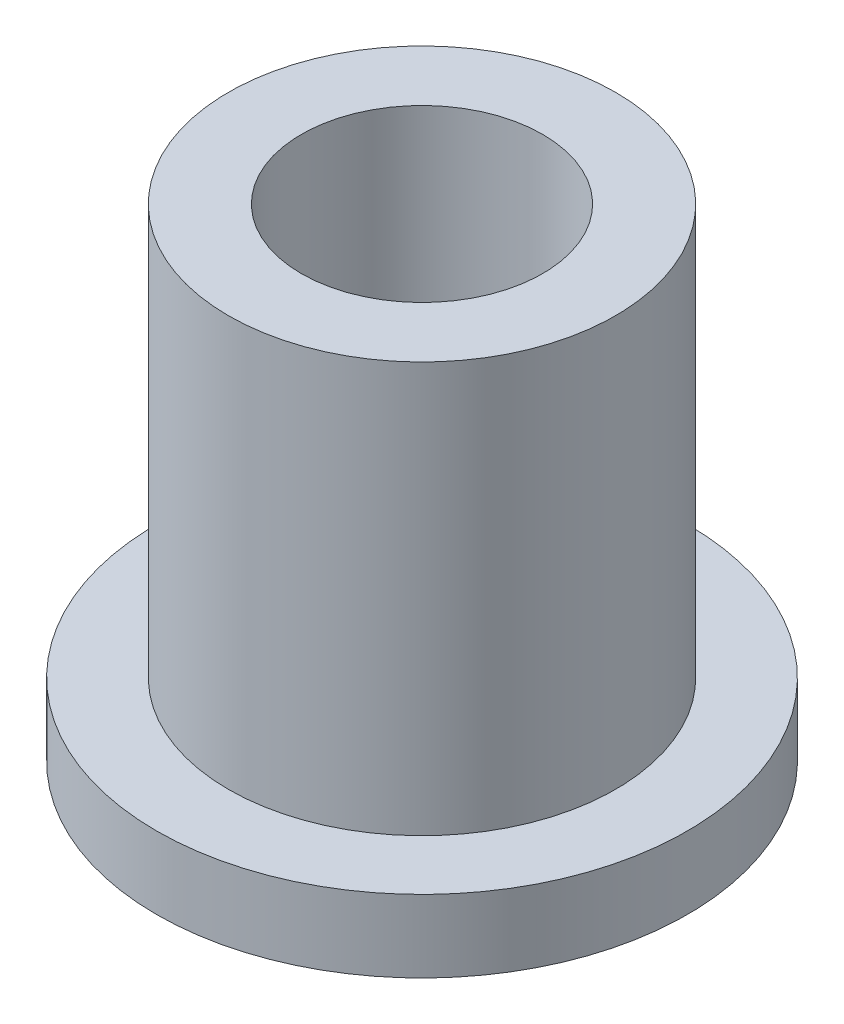
ISO-10303-21;
HEADER;
FILE_DESCRIPTION(('STEP AP214'),'2;1');
FILE_NAME('part.step','',(''),(''),'','','');
FILE_SCHEMA(('AUTOMOTIVE_DESIGN { 1 0 10303 214 1 1 1 1 }'));
ENDSEC;
DATA;
#1=APPLICATION_CONTEXT('core data for automotive mechanical design processes');
#2=APPLICATION_PROTOCOL_DEFINITION('international standard','automotive_design',2000,#1);
#3=PRODUCT_CONTEXT('',#1,'mechanical');
#4=PRODUCT('Part','Part','',(#3));
#5=PRODUCT_RELATED_PRODUCT_CATEGORY('part','',(#4));
#6=PRODUCT_DEFINITION_FORMATION('','',#4);
#7=PRODUCT_DEFINITION_CONTEXT('part definition',#1,'design');
#8=PRODUCT_DEFINITION('design','',#6,#7);
#9=PRODUCT_DEFINITION_SHAPE('','',#8);
#10=(LENGTH_UNIT() NAMED_UNIT(*) SI_UNIT(.MILLI.,.METRE.));
#11=(NAMED_UNIT(*) PLANE_ANGLE_UNIT() SI_UNIT($,.RADIAN.));
#12=(NAMED_UNIT(*) SI_UNIT($,.STERADIAN.) SOLID_ANGLE_UNIT());
#13=UNCERTAINTY_MEASURE_WITH_UNIT(LENGTH_MEASURE(1.E-05),#10,'distance_accuracy_value','');
#14=(GEOMETRIC_REPRESENTATION_CONTEXT(3) GLOBAL_UNCERTAINTY_ASSIGNED_CONTEXT((#13)) GLOBAL_UNIT_ASSIGNED_CONTEXT((#10,
#11,#12)) REPRESENTATION_CONTEXT('',''));
#15=CARTESIAN_POINT('',(0.,0.,0.));
#16=DIRECTION('',(0.,0.,1.));
#17=DIRECTION('',(1.,0.,0.));
#18=AXIS2_PLACEMENT_3D('',#15,#16,#17);
#19=CARTESIAN_POINT('',(0.,10.,0.));
#20=DIRECTION('',(0.,1.,0.));
#21=DIRECTION('',(0.,0.,1.));
#22=AXIS2_PLACEMENT_3D('',#19,#20,#21);
#23=PLANE('',#22);
#24=CARTESIAN_POINT('',(0.,10.,0.));
#25=DIRECTION('',(0.,1.,0.));
#26=DIRECTION('',(0.,0.,1.));
#27=AXIS2_PLACEMENT_3D('',#24,#25,#26);
#28=CIRCLE('',#27,4.01);
#29=CARTESIAN_POINT('',(0.,10.,4.01));
#30=VERTEX_POINT('',#29);
#31=EDGE_CURVE('E10',#30,#30,#28,.T.);
#32=ORIENTED_EDGE('',*,*,#31,.T.);
#33=EDGE_LOOP('',(#32));
#34=FACE_BOUND('',#33,.T.);
#35=CARTESIAN_POINT('',(0.,10.,0.));
#36=DIRECTION('',(0.,1.,0.));
#37=DIRECTION('',(0.,0.,1.));
#38=AXIS2_PLACEMENT_3D('',#35,#36,#37);
#39=CIRCLE('',#38,2.5);
#40=CARTESIAN_POINT('',(0.,10.,2.5));
#41=VERTEX_POINT('',#40);
#42=EDGE_CURVE('E37',#41,#41,#39,.T.);
#43=ORIENTED_EDGE('',*,*,#42,.F.);
#44=EDGE_LOOP('',(#43));
#45=FACE_BOUND('',#44,.T.);
#46=ADVANCED_FACE('F30',(#34,#45),#23,.T.);
#47=CARTESIAN_POINT('',(0.,0.,0.));
#48=DIRECTION('',(0.,1.,0.));
#49=DIRECTION('',(0.,0.,1.));
#50=AXIS2_PLACEMENT_3D('',#47,#48,#49);
#51=PLANE('',#50);
#52=CARTESIAN_POINT('',(0.,0.,0.));
#53=DIRECTION('',(0.,1.,0.));
#54=DIRECTION('',(0.,0.,1.));
#55=AXIS2_PLACEMENT_3D('',#52,#53,#54);
#56=CIRCLE('',#55,2.5);
#57=CARTESIAN_POINT('',(0.,0.,2.5));
#58=VERTEX_POINT('',#57);
#59=EDGE_CURVE('E41',#58,#58,#56,.T.);
#60=ORIENTED_EDGE('',*,*,#59,.T.);
#61=EDGE_LOOP('',(#60));
#62=FACE_BOUND('',#61,.T.);
#63=CARTESIAN_POINT('',(0.,0.,0.));
#64=DIRECTION('',(0.,1.,0.));
#65=DIRECTION('',(0.,0.,1.));
#66=AXIS2_PLACEMENT_3D('',#63,#64,#65);
#67=CIRCLE('',#66,5.5);
#68=CARTESIAN_POINT('',(0.,0.,5.5));
#69=VERTEX_POINT('',#68);
#70=EDGE_CURVE('E48',#69,#69,#67,.T.);
#71=ORIENTED_EDGE('',*,*,#70,.F.);
#72=EDGE_LOOP('',(#71));
#73=FACE_BOUND('',#72,.T.);
#74=ADVANCED_FACE('F73',(#62,#73),#51,.F.);
#75=CARTESIAN_POINT('',(0.,10.,0.));
#76=DIRECTION('',(0.,-1.,0.));
#77=DIRECTION('',(0.,0.,-1.));
#78=AXIS2_PLACEMENT_3D('',#75,#76,#77);
#79=CYLINDRICAL_SURFACE('',#78,4.01);
#80=CARTESIAN_POINT('',(0.,1.5,0.));
#81=DIRECTION('',(0.,1.,0.));
#82=DIRECTION('',(0.,0.,1.));
#83=AXIS2_PLACEMENT_3D('',#80,#81,#82);
#84=CIRCLE('',#83,4.01);
#85=CARTESIAN_POINT('',(0.,1.5,4.01));
#86=VERTEX_POINT('',#85);
#87=EDGE_CURVE('E51',#86,#86,#84,.T.);
#88=ORIENTED_EDGE('',*,*,#87,.T.);
#89=EDGE_LOOP('',(#88));
#90=FACE_BOUND('',#89,.T.);
#91=ORIENTED_EDGE('',*,*,#31,.F.);
#92=EDGE_LOOP('',(#91));
#93=FACE_BOUND('',#92,.T.);
#94=ADVANCED_FACE('F32',(#90,#93),#79,.T.);
#95=CARTESIAN_POINT('',(0.,10.,0.));
#96=DIRECTION('',(0.,-1.,0.));
#97=DIRECTION('',(0.,0.,-1.));
#98=AXIS2_PLACEMENT_3D('',#95,#96,#97);
#99=CYLINDRICAL_SURFACE('',#98,2.5);
#100=ORIENTED_EDGE('',*,*,#42,.T.);
#101=EDGE_LOOP('',(#100));
#102=FACE_BOUND('',#101,.T.);
#103=ORIENTED_EDGE('',*,*,#59,.F.);
#104=EDGE_LOOP('',(#103));
#105=FACE_BOUND('',#104,.T.);
#106=ADVANCED_FACE('F62',(#102,#105),#99,.F.);
#107=CARTESIAN_POINT('',(0.,1.5,0.));
#108=DIRECTION('',(0.,1.,0.));
#109=DIRECTION('',(0.,0.,1.));
#110=AXIS2_PLACEMENT_3D('',#107,#108,#109);
#111=PLANE('',#110);
#112=CARTESIAN_POINT('',(0.,1.5,0.));
#113=DIRECTION('',(0.,1.,0.));
#114=DIRECTION('',(0.,0.,1.));
#115=AXIS2_PLACEMENT_3D('',#112,#113,#114);
#116=CIRCLE('',#115,5.5);
#117=CARTESIAN_POINT('',(0.,1.5,5.5));
#118=VERTEX_POINT('',#117);
#119=EDGE_CURVE('E46',#118,#118,#116,.T.);
#120=ORIENTED_EDGE('',*,*,#119,.T.);
#121=EDGE_LOOP('',(#120));
#122=FACE_BOUND('',#121,.T.);
#123=ORIENTED_EDGE('',*,*,#87,.F.);
#124=EDGE_LOOP('',(#123));
#125=FACE_BOUND('',#124,.T.);
#126=ADVANCED_FACE('F59',(#122,#125),#111,.T.);
#127=CARTESIAN_POINT('',(0.,1.5,0.));
#128=DIRECTION('',(0.,-1.,0.));
#129=DIRECTION('',(0.,0.,-1.));
#130=AXIS2_PLACEMENT_3D('',#127,#128,#129);
#131=CYLINDRICAL_SURFACE('',#130,5.5);
#132=ORIENTED_EDGE('',*,*,#119,.F.);
#133=EDGE_LOOP('',(#132));
#134=FACE_BOUND('',#133,.T.);
#135=ORIENTED_EDGE('',*,*,#70,.T.);
#136=EDGE_LOOP('',(#135));
#137=FACE_BOUND('',#136,.T.);
#138=ADVANCED_FACE('F61',(#134,#137),#131,.T.);
#139=CLOSED_SHELL('',(#46,#74,#94,#106,#126,#138));
#140=MANIFOLD_SOLID_BREP('B2',#139);
#141=ADVANCED_BREP_SHAPE_REPRESENTATION('',(#18,#140),#14);
#142=SHAPE_DEFINITION_REPRESENTATION(#9,#141);
ENDSEC;
END-ISO-10303-21;
